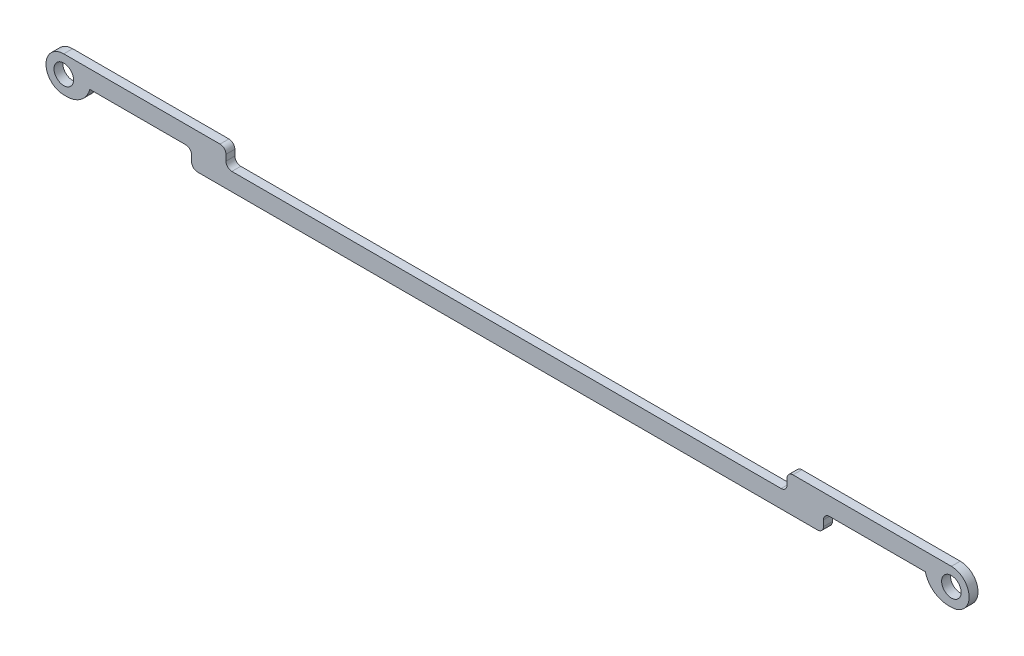
ISO-10303-21;
HEADER;
FILE_DESCRIPTION(('STEP AP214'),'2;1');
FILE_NAME('part.step','',(''),(''),'','','');
FILE_SCHEMA(('AUTOMOTIVE_DESIGN { 1 0 10303 214 1 1 1 1 }'));
ENDSEC;
DATA;
#1=APPLICATION_CONTEXT('core data for automotive mechanical design processes');
#2=APPLICATION_PROTOCOL_DEFINITION('international standard','automotive_design',2000,#1);
#3=PRODUCT_CONTEXT('',#1,'mechanical');
#4=PRODUCT('Part','Part','',(#3));
#5=PRODUCT_RELATED_PRODUCT_CATEGORY('part','',(#4));
#6=PRODUCT_DEFINITION_FORMATION('','',#4);
#7=PRODUCT_DEFINITION_CONTEXT('part definition',#1,'design');
#8=PRODUCT_DEFINITION('design','',#6,#7);
#9=PRODUCT_DEFINITION_SHAPE('','',#8);
#10=(LENGTH_UNIT() NAMED_UNIT(*) SI_UNIT(.MILLI.,.METRE.));
#11=(NAMED_UNIT(*) PLANE_ANGLE_UNIT() SI_UNIT($,.RADIAN.));
#12=(NAMED_UNIT(*) SI_UNIT($,.STERADIAN.) SOLID_ANGLE_UNIT());
#13=UNCERTAINTY_MEASURE_WITH_UNIT(LENGTH_MEASURE(1.E-05),#10,'distance_accuracy_value','');
#14=(GEOMETRIC_REPRESENTATION_CONTEXT(3) GLOBAL_UNCERTAINTY_ASSIGNED_CONTEXT((#13)) GLOBAL_UNIT_ASSIGNED_CONTEXT((#10,
#11,#12)) REPRESENTATION_CONTEXT('',''));
#15=CARTESIAN_POINT('',(0.,0.,0.));
#16=DIRECTION('',(0.,0.,1.));
#17=DIRECTION('',(1.,0.,0.));
#18=AXIS2_PLACEMENT_3D('',#15,#16,#17);
#19=CARTESIAN_POINT('',(0.,3.,1.5));
#20=DIRECTION('',(0.,-1.,0.));
#21=DIRECTION('',(0.,0.,-1.));
#22=AXIS2_PLACEMENT_3D('',#19,#20,#21);
#23=PLANE('',#22);
#24=DIRECTION('',(-1.,0.,0.));
#25=VECTOR('',#24,1.);
#26=CARTESIAN_POINT('',(0.,3.,1.5));
#27=LINE('',#26,#25);
#28=CARTESIAN_POINT('',(26.4131781331171,3.,1.5));
#29=VERTEX_POINT('',#28);
#30=CARTESIAN_POINT('',(0.,3.,1.5));
#31=VERTEX_POINT('',#30);
#32=EDGE_CURVE('E268',#29,#31,#27,.T.);
#33=ORIENTED_EDGE('',*,*,#32,.F.);
#34=DIRECTION('',(0.,0.,-1.));
#35=VECTOR('',#34,1.);
#36=CARTESIAN_POINT('',(26.4131781331171,3.,1.5));
#37=LINE('',#36,#35);
#38=CARTESIAN_POINT('',(26.4131781331171,3.,0.));
#39=VERTEX_POINT('',#38);
#40=EDGE_CURVE('E365',#29,#39,#37,.T.);
#41=ORIENTED_EDGE('',*,*,#40,.T.);
#42=DIRECTION('',(-1.,0.,0.));
#43=VECTOR('',#42,1.);
#44=CARTESIAN_POINT('',(0.,3.,0.));
#45=LINE('',#44,#43);
#46=CARTESIAN_POINT('',(0.,3.,0.));
#47=VERTEX_POINT('',#46);
#48=EDGE_CURVE('E281',#39,#47,#45,.T.);
#49=ORIENTED_EDGE('',*,*,#48,.T.);
#50=DIRECTION('',(0.,0.,-1.));
#51=VECTOR('',#50,1.);
#52=CARTESIAN_POINT('',(0.,3.,1.5));
#53=LINE('',#52,#51);
#54=EDGE_CURVE('E271',#31,#47,#53,.T.);
#55=ORIENTED_EDGE('',*,*,#54,.F.);
#56=EDGE_LOOP('',(#33,#41,#49,#55));
#57=FACE_BOUND('',#56,.T.);
#58=ADVANCED_FACE('F40',(#57),#23,.F.);
#59=CARTESIAN_POINT('',(0.,-3.,1.5));
#60=DIRECTION('',(0.,1.,0.));
#61=DIRECTION('',(0.,0.,1.));
#62=AXIS2_PLACEMENT_3D('',#59,#60,#61);
#63=PLANE('',#62);
#64=DIRECTION('',(1.,0.,0.));
#65=VECTOR('',#64,1.);
#66=CARTESIAN_POINT('',(0.,-3.,0.));
#67=LINE('',#66,#65);
#68=CARTESIAN_POINT('',(0.,-3.,0.));
#69=VERTEX_POINT('',#68);
#70=CARTESIAN_POINT('',(0.524849164062553,-3.,0.));
#71=VERTEX_POINT('',#70);
#72=EDGE_CURVE('E275',#69,#71,#67,.T.);
#73=ORIENTED_EDGE('',*,*,#72,.T.);
#74=DIRECTION('',(0.,0.,-1.));
#75=VECTOR('',#74,1.);
#76=CARTESIAN_POINT('',(0.524849164062553,-3.,1.5));
#77=LINE('',#76,#75);
#78=CARTESIAN_POINT('',(0.524849164062553,-3.,1.5));
#79=VERTEX_POINT('',#78);
#80=EDGE_CURVE('E306',#71,#79,#77,.F.);
#81=ORIENTED_EDGE('',*,*,#80,.T.);
#82=DIRECTION('',(1.,0.,0.));
#83=VECTOR('',#82,1.);
#84=CARTESIAN_POINT('',(0.,-3.,1.5));
#85=LINE('',#84,#83);
#86=CARTESIAN_POINT('',(0.,-3.,1.5));
#87=VERTEX_POINT('',#86);
#88=EDGE_CURVE('E220',#87,#79,#85,.T.);
#89=ORIENTED_EDGE('',*,*,#88,.F.);
#90=DIRECTION('',(0.,0.,-1.));
#91=VECTOR('',#90,1.);
#92=CARTESIAN_POINT('',(0.,-3.,1.5));
#93=LINE('',#92,#91);
#94=EDGE_CURVE('E292',#87,#69,#93,.T.);
#95=ORIENTED_EDGE('',*,*,#94,.T.);
#96=EDGE_LOOP('',(#73,#81,#89,#95));
#97=FACE_BOUND('',#96,.T.);
#98=ADVANCED_FACE('F480',(#97),#63,.F.);
#99=CARTESIAN_POINT('',(22.6079407956582,-3.,1.5));
#100=VERTEX_POINT('',#99);
#101=CARTESIAN_POINT('',(127.392059204342,-3.,1.5));
#102=VERTEX_POINT('',#101);
#103=EDGE_CURVE('E266',#100,#102,#85,.T.);
#104=ORIENTED_EDGE('',*,*,#103,.F.);
#105=DIRECTION('',(0.,0.,-1.));
#106=VECTOR('',#105,1.);
#107=CARTESIAN_POINT('',(22.6079407956582,-3.,1.5));
#108=LINE('',#107,#106);
#109=CARTESIAN_POINT('',(22.6079407956582,-3.,0.));
#110=VERTEX_POINT('',#109);
#111=EDGE_CURVE('E311',#100,#110,#108,.T.);
#112=ORIENTED_EDGE('',*,*,#111,.T.);
#113=CARTESIAN_POINT('',(127.392059204342,-3.,0.));
#114=VERTEX_POINT('',#113);
#115=EDGE_CURVE('E279',#110,#114,#67,.T.);
#116=ORIENTED_EDGE('',*,*,#115,.T.);
#117=DIRECTION('',(0.,0.,1.));
#118=VECTOR('',#117,1.);
#119=CARTESIAN_POINT('',(127.392059204342,-3.,1.5));
#120=LINE('',#119,#118);
#121=EDGE_CURVE('E308',#114,#102,#120,.T.);
#122=ORIENTED_EDGE('',*,*,#121,.T.);
#123=EDGE_LOOP('',(#104,#112,#116,#122));
#124=FACE_BOUND('',#123,.T.);
#125=ADVANCED_FACE('F428',(#124),#63,.F.);
#126=CARTESIAN_POINT('',(0.,0.,1.5));
#127=DIRECTION('',(0.,0.,1.));
#128=DIRECTION('',(1.,0.,0.));
#129=AXIS2_PLACEMENT_3D('',#126,#127,#128);
#130=PLANE('',#129);
#131=CARTESIAN_POINT('',(150.,3.,1.5));
#132=VERTEX_POINT('',#131);
#133=CARTESIAN_POINT('',(123.23055523657,3.,1.5));
#134=VERTEX_POINT('',#133);
#135=EDGE_CURVE('E269',#132,#134,#27,.T.);
#136=ORIENTED_EDGE('',*,*,#135,.T.);
#137=CARTESIAN_POINT('',(123.23055523657,2.,1.5));
#138=DIRECTION('',(0.,0.,1.));
#139=DIRECTION('',(1.,0.,0.));
#140=AXIS2_PLACEMENT_3D('',#137,#138,#139);
#141=CIRCLE('',#140,1.);
#142=CARTESIAN_POINT('',(122.23055523657,2.,1.5));
#143=VERTEX_POINT('',#142);
#144=EDGE_CURVE('E360',#134,#143,#141,.T.);
#145=ORIENTED_EDGE('',*,*,#144,.T.);
#146=DIRECTION('',(0.,1.,0.));
#147=VECTOR('',#146,1.);
#148=CARTESIAN_POINT('',(122.23055523657,9.54874152774472,1.5));
#149=LINE('',#148,#147);
#150=CARTESIAN_POINT('',(122.23055523657,0.999999999999999,1.5));
#151=VERTEX_POINT('',#150);
#152=EDGE_CURVE('E405',#151,#143,#149,.T.);
#153=ORIENTED_EDGE('',*,*,#152,.F.);
#154=CARTESIAN_POINT('',(121.23055523657,0.999999999999999,1.5));
#155=DIRECTION('',(0.,0.,1.));
#156=DIRECTION('',(1.,0.,0.));
#157=AXIS2_PLACEMENT_3D('',#154,#155,#156);
#158=CIRCLE('',#157,1.);
#159=CARTESIAN_POINT('',(121.23055523657,0.,1.5));
#160=VERTEX_POINT('',#159);
#161=EDGE_CURVE('E371',#151,#160,#158,.F.);
#162=ORIENTED_EDGE('',*,*,#161,.T.);
#163=DIRECTION('',(1.,0.,0.));
#164=VECTOR('',#163,1.);
#165=CARTESIAN_POINT('',(27.4131781331171,0.,1.5));
#166=LINE('',#165,#164);
#167=CARTESIAN_POINT('',(28.4131781331171,0.,1.5));
#168=VERTEX_POINT('',#167);
#169=EDGE_CURVE('E379',#168,#160,#166,.T.);
#170=ORIENTED_EDGE('',*,*,#169,.F.);
#171=CARTESIAN_POINT('',(28.4131781331171,1.,1.5));
#172=DIRECTION('',(0.,0.,1.));
#173=DIRECTION('',(1.,0.,0.));
#174=AXIS2_PLACEMENT_3D('',#171,#172,#173);
#175=CIRCLE('',#174,1.);
#176=CARTESIAN_POINT('',(27.4131781331171,0.999999999999999,1.5));
#177=VERTEX_POINT('',#176);
#178=EDGE_CURVE('E48',#168,#177,#175,.F.);
#179=ORIENTED_EDGE('',*,*,#178,.T.);
#180=DIRECTION('',(0.,-1.,0.));
#181=VECTOR('',#180,1.);
#182=CARTESIAN_POINT('',(27.4131781331171,9.54874152774472,1.5));
#183=LINE('',#182,#181);
#184=CARTESIAN_POINT('',(27.4131781331171,2.,1.5));
#185=VERTEX_POINT('',#184);
#186=EDGE_CURVE('E376',#185,#177,#183,.T.);
#187=ORIENTED_EDGE('',*,*,#186,.F.);
#188=CARTESIAN_POINT('',(26.4131781331171,2.,1.5));
#189=DIRECTION('',(0.,0.,1.));
#190=DIRECTION('',(1.,0.,0.));
#191=AXIS2_PLACEMENT_3D('',#188,#189,#190);
#192=CIRCLE('',#191,1.);
#193=EDGE_CURVE('E358',#185,#29,#192,.T.);
#194=ORIENTED_EDGE('',*,*,#193,.T.);
#195=ORIENTED_EDGE('',*,*,#32,.T.);
#196=CARTESIAN_POINT('',(0.,0.,1.5));
#197=DIRECTION('',(0.,0.,1.));
#198=DIRECTION('',(1.,0.,0.));
#199=AXIS2_PLACEMENT_3D('',#196,#197,#198);
#200=CIRCLE('',#199,3.);
#201=EDGE_CURVE('E260',#31,#87,#200,.T.);
#202=ORIENTED_EDGE('',*,*,#201,.T.);
#203=ORIENTED_EDGE('',*,*,#88,.T.);
#204=CARTESIAN_POINT('',(0.524849164062553,1.,1.5));
#205=DIRECTION('',(0.,0.,1.));
#206=DIRECTION('',(1.,0.,0.));
#207=AXIS2_PLACEMENT_3D('',#204,#205,#206);
#208=CIRCLE('',#207,4.);
#209=CARTESIAN_POINT('',(4.39783251026997,0.,1.5));
#210=VERTEX_POINT('',#209);
#211=EDGE_CURVE('E215',#79,#210,#208,.T.);
#212=ORIENTED_EDGE('',*,*,#211,.T.);
#213=DIRECTION('',(-1.,0.,0.));
#214=VECTOR('',#213,1.);
#215=CARTESIAN_POINT('',(4.39783251026997,0.,1.5));
#216=LINE('',#215,#214);
#217=CARTESIAN_POINT('',(20.6079407956581,0.,1.5));
#218=VERTEX_POINT('',#217);
#219=EDGE_CURVE('E202',#218,#210,#216,.T.);
#220=ORIENTED_EDGE('',*,*,#219,.F.);
#221=CARTESIAN_POINT('',(20.6079407956581,-1.,1.5));
#222=DIRECTION('',(0.,0.,1.));
#223=DIRECTION('',(1.,0.,0.));
#224=AXIS2_PLACEMENT_3D('',#221,#222,#223);
#225=CIRCLE('',#224,1.);
#226=CARTESIAN_POINT('',(21.6079407956581,-1.,1.5));
#227=VERTEX_POINT('',#226);
#228=EDGE_CURVE('E334',#218,#227,#225,.F.);
#229=ORIENTED_EDGE('',*,*,#228,.T.);
#230=DIRECTION('',(0.,1.,0.));
#231=VECTOR('',#230,1.);
#232=CARTESIAN_POINT('',(21.6079407956581,-5.43793538641678,1.5));
#233=LINE('',#232,#231);
#234=CARTESIAN_POINT('',(21.6079407956581,-2.,1.5));
#235=VERTEX_POINT('',#234);
#236=EDGE_CURVE('E212',#235,#227,#233,.T.);
#237=ORIENTED_EDGE('',*,*,#236,.F.);
#238=CARTESIAN_POINT('',(22.6079407956582,-2.,1.5));
#239=DIRECTION('',(0.,0.,1.));
#240=DIRECTION('',(1.,0.,0.));
#241=AXIS2_PLACEMENT_3D('',#238,#239,#240);
#242=CIRCLE('',#241,1.);
#243=EDGE_CURVE('E324',#235,#100,#242,.T.);
#244=ORIENTED_EDGE('',*,*,#243,.T.);
#245=ORIENTED_EDGE('',*,*,#103,.T.);
#246=CARTESIAN_POINT('',(127.392059204342,-2.,1.5));
#247=DIRECTION('',(0.,0.,1.));
#248=DIRECTION('',(1.,0.,0.));
#249=AXIS2_PLACEMENT_3D('',#246,#247,#248);
#250=CIRCLE('',#249,1.);
#251=CARTESIAN_POINT('',(128.392059204342,-2.,1.5));
#252=VERTEX_POINT('',#251);
#253=EDGE_CURVE('E322',#102,#252,#250,.T.);
#254=ORIENTED_EDGE('',*,*,#253,.T.);
#255=DIRECTION('',(0.,-1.,0.));
#256=VECTOR('',#255,1.);
#257=CARTESIAN_POINT('',(128.392059204342,-5.43793538641678,1.5));
#258=LINE('',#257,#256);
#259=CARTESIAN_POINT('',(128.392059204342,-1.,1.5));
#260=VERTEX_POINT('',#259);
#261=EDGE_CURVE('E239',#260,#252,#258,.T.);
#262=ORIENTED_EDGE('',*,*,#261,.F.);
#263=CARTESIAN_POINT('',(129.392059204342,-1.,1.5));
#264=DIRECTION('',(0.,0.,1.));
#265=DIRECTION('',(1.,0.,0.));
#266=AXIS2_PLACEMENT_3D('',#263,#264,#265);
#267=CIRCLE('',#266,1.);
#268=CARTESIAN_POINT('',(129.392059204342,0.,1.5));
#269=VERTEX_POINT('',#268);
#270=EDGE_CURVE('E338',#260,#269,#267,.F.);
#271=ORIENTED_EDGE('',*,*,#270,.T.);
#272=DIRECTION('',(-1.,0.,0.));
#273=VECTOR('',#272,1.);
#274=CARTESIAN_POINT('',(145.60216748973,0.,1.5));
#275=LINE('',#274,#273);
#276=CARTESIAN_POINT('',(145.60216748973,0.,1.5));
#277=VERTEX_POINT('',#276);
#278=EDGE_CURVE('E236',#277,#269,#275,.T.);
#279=ORIENTED_EDGE('',*,*,#278,.F.);
#280=CARTESIAN_POINT('',(149.475150835937,1.,1.5));
#281=DIRECTION('',(0.,0.,1.));
#282=DIRECTION('',(1.,0.,0.));
#283=AXIS2_PLACEMENT_3D('',#280,#281,#282);
#284=CIRCLE('',#283,4.);
#285=CARTESIAN_POINT('',(149.475150835937,-3.,1.5));
#286=VERTEX_POINT('',#285);
#287=EDGE_CURVE('E224',#277,#286,#284,.T.);
#288=ORIENTED_EDGE('',*,*,#287,.T.);
#289=CARTESIAN_POINT('',(150.,-3.,1.5));
#290=VERTEX_POINT('',#289);
#291=EDGE_CURVE('E262',#286,#290,#85,.T.);
#292=ORIENTED_EDGE('',*,*,#291,.T.);
#293=CARTESIAN_POINT('',(150.,0.,1.5));
#294=DIRECTION('',(0.,0.,1.));
#295=DIRECTION('',(1.,0.,0.));
#296=AXIS2_PLACEMENT_3D('',#293,#294,#295);
#297=CIRCLE('',#296,3.);
#298=EDGE_CURVE('E265',#290,#132,#297,.T.);
#299=ORIENTED_EDGE('',*,*,#298,.T.);
#300=EDGE_LOOP('',(#136,#145,#153,#162,#170,#179,#187,#194,#195,#202,#203,#212,#220,#229,#237,
#244,#245,#254,#262,#271,#279,#288,#292,#299));
#301=FACE_BOUND('',#300,.T.);
#302=CARTESIAN_POINT('',(0.,0.,1.5));
#303=DIRECTION('',(0.,0.,1.));
#304=DIRECTION('',(1.,0.,0.));
#305=AXIS2_PLACEMENT_3D('',#302,#303,#304);
#306=CIRCLE('',#305,1.65);
#307=CARTESIAN_POINT('',(1.65,0.,1.5));
#308=VERTEX_POINT('',#307);
#309=EDGE_CURVE('E254',#308,#308,#306,.T.);
#310=ORIENTED_EDGE('',*,*,#309,.F.);
#311=EDGE_LOOP('',(#310));
#312=FACE_BOUND('',#311,.T.);
#313=CARTESIAN_POINT('',(150.,0.,1.5));
#314=DIRECTION('',(0.,0.,1.));
#315=DIRECTION('',(1.,0.,0.));
#316=AXIS2_PLACEMENT_3D('',#313,#314,#315);
#317=CIRCLE('',#316,1.65000000000002);
#318=CARTESIAN_POINT('',(151.65,0.,1.5));
#319=VERTEX_POINT('',#318);
#320=EDGE_CURVE('E248',#319,#319,#317,.T.);
#321=ORIENTED_EDGE('',*,*,#320,.F.);
#322=EDGE_LOOP('',(#321));
#323=FACE_BOUND('',#322,.T.);
#324=ADVANCED_FACE('F217',(#301,#312,#323),#130,.T.);
#325=CARTESIAN_POINT('',(0.,0.,0.));
#326=DIRECTION('',(0.,0.,1.));
#327=DIRECTION('',(1.,0.,0.));
#328=AXIS2_PLACEMENT_3D('',#325,#326,#327);
#329=PLANE('',#328);
#330=DIRECTION('',(0.,1.,0.));
#331=VECTOR('',#330,1.);
#332=CARTESIAN_POINT('',(122.23055523657,0.,0.));
#333=LINE('',#332,#331);
#334=CARTESIAN_POINT('',(122.23055523657,0.999999999999999,0.));
#335=VERTEX_POINT('',#334);
#336=CARTESIAN_POINT('',(122.23055523657,2.,0.));
#337=VERTEX_POINT('',#336);
#338=EDGE_CURVE('E398',#335,#337,#333,.T.);
#339=ORIENTED_EDGE('',*,*,#338,.T.);
#340=CARTESIAN_POINT('',(123.23055523657,2.,0.));
#341=DIRECTION('',(0.,0.,1.));
#342=DIRECTION('',(1.,0.,0.));
#343=AXIS2_PLACEMENT_3D('',#340,#341,#342);
#344=CIRCLE('',#343,1.);
#345=CARTESIAN_POINT('',(123.23055523657,3.,0.));
#346=VERTEX_POINT('',#345);
#347=EDGE_CURVE('E363',#337,#346,#344,.F.);
#348=ORIENTED_EDGE('',*,*,#347,.T.);
#349=CARTESIAN_POINT('',(150.,3.,0.));
#350=VERTEX_POINT('',#349);
#351=EDGE_CURVE('E263',#350,#346,#45,.T.);
#352=ORIENTED_EDGE('',*,*,#351,.F.);
#353=CARTESIAN_POINT('',(150.,0.,0.));
#354=DIRECTION('',(0.,0.,1.));
#355=DIRECTION('',(1.,0.,0.));
#356=AXIS2_PLACEMENT_3D('',#353,#354,#355);
#357=CIRCLE('',#356,3.);
#358=CARTESIAN_POINT('',(150.,-3.,0.));
#359=VERTEX_POINT('',#358);
#360=EDGE_CURVE('E278',#359,#350,#357,.T.);
#361=ORIENTED_EDGE('',*,*,#360,.F.);
#362=CARTESIAN_POINT('',(149.475150835937,-3.,0.));
#363=VERTEX_POINT('',#362);
#364=EDGE_CURVE('E274',#363,#359,#67,.T.);
#365=ORIENTED_EDGE('',*,*,#364,.F.);
#366=CARTESIAN_POINT('',(149.475150835937,1.,0.));
#367=DIRECTION('',(0.,0.,1.));
#368=DIRECTION('',(1.,0.,0.));
#369=AXIS2_PLACEMENT_3D('',#366,#367,#368);
#370=CIRCLE('',#369,4.);
#371=CARTESIAN_POINT('',(145.60216748973,0.,0.));
#372=VERTEX_POINT('',#371);
#373=EDGE_CURVE('E225',#363,#372,#370,.F.);
#374=ORIENTED_EDGE('',*,*,#373,.T.);
#375=DIRECTION('',(-1.,0.,0.));
#376=VECTOR('',#375,1.);
#377=CARTESIAN_POINT('',(0.,0.,0.));
#378=LINE('',#377,#376);
#379=CARTESIAN_POINT('',(129.392059204342,0.,0.));
#380=VERTEX_POINT('',#379);
#381=EDGE_CURVE('E295',#372,#380,#378,.T.);
#382=ORIENTED_EDGE('',*,*,#381,.T.);
#383=CARTESIAN_POINT('',(129.392059204342,-1.,0.));
#384=DIRECTION('',(0.,0.,1.));
#385=DIRECTION('',(1.,0.,0.));
#386=AXIS2_PLACEMENT_3D('',#383,#384,#385);
#387=CIRCLE('',#386,1.);
#388=CARTESIAN_POINT('',(128.392059204342,-1.,0.));
#389=VERTEX_POINT('',#388);
#390=EDGE_CURVE('E340',#380,#389,#387,.T.);
#391=ORIENTED_EDGE('',*,*,#390,.T.);
#392=DIRECTION('',(0.,-1.,0.));
#393=VECTOR('',#392,1.);
#394=CARTESIAN_POINT('',(128.392059204342,0.,0.));
#395=LINE('',#394,#393);
#396=CARTESIAN_POINT('',(128.392059204342,-2.,0.));
#397=VERTEX_POINT('',#396);
#398=EDGE_CURVE('E229',#389,#397,#395,.T.);
#399=ORIENTED_EDGE('',*,*,#398,.T.);
#400=CARTESIAN_POINT('',(127.392059204342,-2.,0.));
#401=DIRECTION('',(0.,0.,1.));
#402=DIRECTION('',(1.,0.,0.));
#403=AXIS2_PLACEMENT_3D('',#400,#401,#402);
#404=CIRCLE('',#403,1.);
#405=EDGE_CURVE('E314',#397,#114,#404,.F.);
#406=ORIENTED_EDGE('',*,*,#405,.T.);
#407=ORIENTED_EDGE('',*,*,#115,.F.);
#408=CARTESIAN_POINT('',(22.6079407956582,-2.,0.));
#409=DIRECTION('',(0.,0.,1.));
#410=DIRECTION('',(1.,0.,0.));
#411=AXIS2_PLACEMENT_3D('',#408,#409,#410);
#412=CIRCLE('',#411,1.);
#413=CARTESIAN_POINT('',(21.6079407956581,-2.,0.));
#414=VERTEX_POINT('',#413);
#415=EDGE_CURVE('E316',#110,#414,#412,.F.);
#416=ORIENTED_EDGE('',*,*,#415,.T.);
#417=DIRECTION('',(0.,1.,0.));
#418=VECTOR('',#417,1.);
#419=CARTESIAN_POINT('',(21.6079407956581,0.,0.));
#420=LINE('',#419,#418);
#421=CARTESIAN_POINT('',(21.6079407956581,-1.,0.));
#422=VERTEX_POINT('',#421);
#423=EDGE_CURVE('E232',#414,#422,#420,.T.);
#424=ORIENTED_EDGE('',*,*,#423,.T.);
#425=CARTESIAN_POINT('',(20.6079407956581,-1.,0.));
#426=DIRECTION('',(0.,0.,1.));
#427=DIRECTION('',(1.,0.,0.));
#428=AXIS2_PLACEMENT_3D('',#425,#426,#427);
#429=CIRCLE('',#428,1.);
#430=CARTESIAN_POINT('',(20.6079407956581,0.,0.));
#431=VERTEX_POINT('',#430);
#432=EDGE_CURVE('E336',#422,#431,#429,.T.);
#433=ORIENTED_EDGE('',*,*,#432,.T.);
#434=DIRECTION('',(-1.,0.,0.));
#435=VECTOR('',#434,1.);
#436=CARTESIAN_POINT('',(0.,0.,0.));
#437=LINE('',#436,#435);
#438=CARTESIAN_POINT('',(4.39783251026997,0.,0.));
#439=VERTEX_POINT('',#438);
#440=EDGE_CURVE('E298',#431,#439,#437,.T.);
#441=ORIENTED_EDGE('',*,*,#440,.T.);
#442=CARTESIAN_POINT('',(0.524849164062553,1.,0.));
#443=DIRECTION('',(0.,0.,1.));
#444=DIRECTION('',(1.,0.,0.));
#445=AXIS2_PLACEMENT_3D('',#442,#443,#444);
#446=CIRCLE('',#445,4.);
#447=EDGE_CURVE('E228',#439,#71,#446,.F.);
#448=ORIENTED_EDGE('',*,*,#447,.T.);
#449=ORIENTED_EDGE('',*,*,#72,.F.);
#450=CARTESIAN_POINT('',(0.,0.,0.));
#451=DIRECTION('',(0.,0.,1.));
#452=DIRECTION('',(1.,0.,0.));
#453=AXIS2_PLACEMENT_3D('',#450,#451,#452);
#454=CIRCLE('',#453,3.);
#455=EDGE_CURVE('E257',#47,#69,#454,.T.);
#456=ORIENTED_EDGE('',*,*,#455,.F.);
#457=ORIENTED_EDGE('',*,*,#48,.F.);
#458=CARTESIAN_POINT('',(26.4131781331171,2.,0.));
#459=DIRECTION('',(0.,0.,1.));
#460=DIRECTION('',(1.,0.,0.));
#461=AXIS2_PLACEMENT_3D('',#458,#459,#460);
#462=CIRCLE('',#461,1.);
#463=CARTESIAN_POINT('',(27.4131781331171,2.,0.));
#464=VERTEX_POINT('',#463);
#465=EDGE_CURVE('E62',#39,#464,#462,.F.);
#466=ORIENTED_EDGE('',*,*,#465,.T.);
#467=DIRECTION('',(0.,-1.,0.));
#468=VECTOR('',#467,1.);
#469=CARTESIAN_POINT('',(27.4131781331171,0.,0.));
#470=LINE('',#469,#468);
#471=CARTESIAN_POINT('',(27.4131781331171,1.,0.));
#472=VERTEX_POINT('',#471);
#473=EDGE_CURVE('E240',#464,#472,#470,.T.);
#474=ORIENTED_EDGE('',*,*,#473,.T.);
#475=CARTESIAN_POINT('',(28.4131781331171,1.,0.));
#476=DIRECTION('',(0.,0.,1.));
#477=DIRECTION('',(1.,0.,0.));
#478=AXIS2_PLACEMENT_3D('',#475,#476,#477);
#479=CIRCLE('',#478,1.);
#480=CARTESIAN_POINT('',(28.4131781331171,0.,0.));
#481=VERTEX_POINT('',#480);
#482=EDGE_CURVE('E11',#472,#481,#479,.T.);
#483=ORIENTED_EDGE('',*,*,#482,.T.);
#484=DIRECTION('',(1.,0.,0.));
#485=VECTOR('',#484,1.);
#486=CARTESIAN_POINT('',(0.,0.,0.));
#487=LINE('',#486,#485);
#488=CARTESIAN_POINT('',(121.23055523657,0.,0.));
#489=VERTEX_POINT('',#488);
#490=EDGE_CURVE('E342',#481,#489,#487,.T.);
#491=ORIENTED_EDGE('',*,*,#490,.T.);
#492=CARTESIAN_POINT('',(121.23055523657,0.999999999999999,0.));
#493=DIRECTION('',(0.,0.,1.));
#494=DIRECTION('',(1.,0.,0.));
#495=AXIS2_PLACEMENT_3D('',#492,#493,#494);
#496=CIRCLE('',#495,1.);
#497=EDGE_CURVE('E373',#489,#335,#496,.T.);
#498=ORIENTED_EDGE('',*,*,#497,.T.);
#499=EDGE_LOOP('',(#339,#348,#352,#361,#365,#374,#382,#391,#399,#406,#407,#416,#424,#433,#441,
#448,#449,#456,#457,#466,#474,#483,#491,#498));
#500=FACE_BOUND('',#499,.T.);
#501=CARTESIAN_POINT('',(0.,0.,0.));
#502=DIRECTION('',(0.,0.,1.));
#503=DIRECTION('',(1.,0.,0.));
#504=AXIS2_PLACEMENT_3D('',#501,#502,#503);
#505=CIRCLE('',#504,1.65);
#506=CARTESIAN_POINT('',(1.65,0.,0.));
#507=VERTEX_POINT('',#506);
#508=EDGE_CURVE('E251',#507,#507,#505,.T.);
#509=ORIENTED_EDGE('',*,*,#508,.T.);
#510=EDGE_LOOP('',(#509));
#511=FACE_BOUND('',#510,.T.);
#512=CARTESIAN_POINT('',(150.,0.,0.));
#513=DIRECTION('',(0.,0.,1.));
#514=DIRECTION('',(1.,0.,0.));
#515=AXIS2_PLACEMENT_3D('',#512,#513,#514);
#516=CIRCLE('',#515,1.65000000000002);
#517=CARTESIAN_POINT('',(151.65,0.,0.));
#518=VERTEX_POINT('',#517);
#519=EDGE_CURVE('E247',#518,#518,#516,.T.);
#520=ORIENTED_EDGE('',*,*,#519,.T.);
#521=EDGE_LOOP('',(#520));
#522=FACE_BOUND('',#521,.T.);
#523=ADVANCED_FACE('F388',(#500,#511,#522),#329,.F.);
#524=CARTESIAN_POINT('',(0.,0.,1.5));
#525=DIRECTION('',(0.,0.,-1.));
#526=DIRECTION('',(-1.,0.,0.));
#527=AXIS2_PLACEMENT_3D('',#524,#525,#526);
#528=CYLINDRICAL_SURFACE('',#527,3.);
#529=ORIENTED_EDGE('',*,*,#455,.T.);
#530=ORIENTED_EDGE('',*,*,#94,.F.);
#531=ORIENTED_EDGE('',*,*,#201,.F.);
#532=ORIENTED_EDGE('',*,*,#54,.T.);
#533=EDGE_LOOP('',(#529,#530,#531,#532));
#534=FACE_BOUND('',#533,.T.);
#535=ADVANCED_FACE('F503',(#534),#528,.T.);
#536=ORIENTED_EDGE('',*,*,#291,.F.);
#537=DIRECTION('',(0.,0.,1.));
#538=VECTOR('',#537,1.);
#539=CARTESIAN_POINT('',(149.475150835937,-3.,1.5));
#540=LINE('',#539,#538);
#541=EDGE_CURVE('E300',#286,#363,#540,.F.);
#542=ORIENTED_EDGE('',*,*,#541,.T.);
#543=ORIENTED_EDGE('',*,*,#364,.T.);
#544=DIRECTION('',(0.,0.,-1.));
#545=VECTOR('',#544,1.);
#546=CARTESIAN_POINT('',(150.,-3.,1.5));
#547=LINE('',#546,#545);
#548=EDGE_CURVE('E289',#290,#359,#547,.T.);
#549=ORIENTED_EDGE('',*,*,#548,.F.);
#550=EDGE_LOOP('',(#536,#542,#543,#549));
#551=FACE_BOUND('',#550,.T.);
#552=ADVANCED_FACE('F439',(#551),#63,.F.);
#553=CARTESIAN_POINT('',(150.,0.,1.5));
#554=DIRECTION('',(0.,0.,-1.));
#555=DIRECTION('',(-1.,0.,0.));
#556=AXIS2_PLACEMENT_3D('',#553,#554,#555);
#557=CYLINDRICAL_SURFACE('',#556,3.);
#558=ORIENTED_EDGE('',*,*,#360,.T.);
#559=DIRECTION('',(0.,0.,-1.));
#560=VECTOR('',#559,1.);
#561=CARTESIAN_POINT('',(150.,3.,1.5));
#562=LINE('',#561,#560);
#563=EDGE_CURVE('E286',#132,#350,#562,.T.);
#564=ORIENTED_EDGE('',*,*,#563,.F.);
#565=ORIENTED_EDGE('',*,*,#298,.F.);
#566=ORIENTED_EDGE('',*,*,#548,.T.);
#567=EDGE_LOOP('',(#558,#564,#565,#566));
#568=FACE_BOUND('',#567,.T.);
#569=ADVANCED_FACE('F443',(#568),#557,.T.);
#570=ORIENTED_EDGE('',*,*,#351,.T.);
#571=DIRECTION('',(0.,0.,1.));
#572=VECTOR('',#571,1.);
#573=CARTESIAN_POINT('',(123.23055523657,3.,1.5));
#574=LINE('',#573,#572);
#575=EDGE_CURVE('E355',#346,#134,#574,.T.);
#576=ORIENTED_EDGE('',*,*,#575,.T.);
#577=ORIENTED_EDGE('',*,*,#135,.F.);
#578=ORIENTED_EDGE('',*,*,#563,.T.);
#579=EDGE_LOOP('',(#570,#576,#577,#578));
#580=FACE_BOUND('',#579,.T.);
#581=ADVANCED_FACE('F447',(#580),#23,.F.);
#582=CARTESIAN_POINT('',(0.,0.,1.5));
#583=DIRECTION('',(0.,0.,-1.));
#584=DIRECTION('',(-1.,0.,0.));
#585=AXIS2_PLACEMENT_3D('',#582,#583,#584);
#586=CYLINDRICAL_SURFACE('',#585,1.65);
#587=ORIENTED_EDGE('',*,*,#309,.T.);
#588=EDGE_LOOP('',(#587));
#589=FACE_BOUND('',#588,.T.);
#590=ORIENTED_EDGE('',*,*,#508,.F.);
#591=EDGE_LOOP('',(#590));
#592=FACE_BOUND('',#591,.T.);
#593=ADVANCED_FACE('F492',(#589,#592),#586,.F.);
#594=CARTESIAN_POINT('',(150.,0.,1.5));
#595=DIRECTION('',(0.,0.,-1.));
#596=DIRECTION('',(-1.,0.,0.));
#597=AXIS2_PLACEMENT_3D('',#594,#595,#596);
#598=CYLINDRICAL_SURFACE('',#597,1.65000000000002);
#599=ORIENTED_EDGE('',*,*,#320,.T.);
#600=EDGE_LOOP('',(#599));
#601=FACE_BOUND('',#600,.T.);
#602=ORIENTED_EDGE('',*,*,#519,.F.);
#603=EDGE_LOOP('',(#602));
#604=FACE_BOUND('',#603,.T.);
#605=ADVANCED_FACE('F497',(#601,#604),#598,.F.);
#606=CARTESIAN_POINT('',(145.60216748973,0.,-18.5));
#607=DIRECTION('',(0.,1.,0.));
#608=DIRECTION('',(0.,0.,1.));
#609=AXIS2_PLACEMENT_3D('',#606,#607,#608);
#610=PLANE('',#609);
#611=ORIENTED_EDGE('',*,*,#278,.T.);
#612=DIRECTION('',(0.,0.,1.));
#613=VECTOR('',#612,1.);
#614=CARTESIAN_POINT('',(129.392059204342,0.,0.));
#615=LINE('',#614,#613);
#616=EDGE_CURVE('E332',#269,#380,#615,.F.);
#617=ORIENTED_EDGE('',*,*,#616,.T.);
#618=ORIENTED_EDGE('',*,*,#381,.F.);
#619=DIRECTION('',(0.,0.,1.));
#620=VECTOR('',#619,1.);
#621=CARTESIAN_POINT('',(145.60216748973,0.,-18.5));
#622=LINE('',#621,#620);
#623=EDGE_CURVE('E243',#372,#277,#622,.T.);
#624=ORIENTED_EDGE('',*,*,#623,.T.);
#625=EDGE_LOOP('',(#611,#617,#618,#624));
#626=FACE_BOUND('',#625,.T.);
#627=ADVANCED_FACE('F466',(#626),#610,.F.);
#628=CARTESIAN_POINT('',(128.392059204342,-5.43793538641678,-18.5));
#629=DIRECTION('',(-1.,0.,0.));
#630=DIRECTION('',(0.,0.,1.));
#631=AXIS2_PLACEMENT_3D('',#628,#629,#630);
#632=PLANE('',#631);
#633=ORIENTED_EDGE('',*,*,#398,.F.);
#634=DIRECTION('',(0.,0.,1.));
#635=VECTOR('',#634,1.);
#636=CARTESIAN_POINT('',(128.392059204342,-1.,1.5));
#637=LINE('',#636,#635);
#638=EDGE_CURVE('E329',#389,#260,#637,.T.);
#639=ORIENTED_EDGE('',*,*,#638,.T.);
#640=ORIENTED_EDGE('',*,*,#261,.T.);
#641=DIRECTION('',(0.,0.,1.));
#642=VECTOR('',#641,1.);
#643=CARTESIAN_POINT('',(128.392059204342,-2.,-18.5));
#644=LINE('',#643,#642);
#645=EDGE_CURVE('E327',#252,#397,#644,.F.);
#646=ORIENTED_EDGE('',*,*,#645,.T.);
#647=EDGE_LOOP('',(#633,#639,#640,#646));
#648=FACE_BOUND('',#647,.T.);
#649=ADVANCED_FACE('F459',(#648),#632,.F.);
#650=CARTESIAN_POINT('',(4.39783251026997,0.,-18.5));
#651=DIRECTION('',(0.,1.,0.));
#652=DIRECTION('',(0.,0.,1.));
#653=AXIS2_PLACEMENT_3D('',#650,#651,#652);
#654=PLANE('',#653);
#655=ORIENTED_EDGE('',*,*,#440,.F.);
#656=DIRECTION('',(0.,0.,1.));
#657=VECTOR('',#656,1.);
#658=CARTESIAN_POINT('',(20.6079407956581,0.,1.5));
#659=LINE('',#658,#657);
#660=EDGE_CURVE('E210',#431,#218,#659,.T.);
#661=ORIENTED_EDGE('',*,*,#660,.T.);
#662=ORIENTED_EDGE('',*,*,#219,.T.);
#663=DIRECTION('',(0.,0.,1.));
#664=VECTOR('',#663,1.);
#665=CARTESIAN_POINT('',(4.39783251026997,0.,-18.5));
#666=LINE('',#665,#664);
#667=EDGE_CURVE('E207',#439,#210,#666,.T.);
#668=ORIENTED_EDGE('',*,*,#667,.F.);
#669=EDGE_LOOP('',(#655,#661,#662,#668));
#670=FACE_BOUND('',#669,.T.);
#671=ADVANCED_FACE('F205',(#670),#654,.F.);
#672=CARTESIAN_POINT('',(21.6079407956581,-5.43793538641678,-18.5));
#673=DIRECTION('',(1.,0.,0.));
#674=DIRECTION('',(0.,0.,-1.));
#675=AXIS2_PLACEMENT_3D('',#672,#673,#674);
#676=PLANE('',#675);
#677=ORIENTED_EDGE('',*,*,#423,.F.);
#678=DIRECTION('',(0.,0.,-1.));
#679=VECTOR('',#678,1.);
#680=CARTESIAN_POINT('',(21.6079407956581,-2.,-18.5));
#681=LINE('',#680,#679);
#682=EDGE_CURVE('E320',#414,#235,#681,.F.);
#683=ORIENTED_EDGE('',*,*,#682,.T.);
#684=ORIENTED_EDGE('',*,*,#236,.T.);
#685=DIRECTION('',(0.,0.,1.));
#686=VECTOR('',#685,1.);
#687=CARTESIAN_POINT('',(21.6079407956581,-1.,0.));
#688=LINE('',#687,#686);
#689=EDGE_CURVE('E318',#227,#422,#688,.F.);
#690=ORIENTED_EDGE('',*,*,#689,.T.);
#691=EDGE_LOOP('',(#677,#683,#684,#690));
#692=FACE_BOUND('',#691,.T.);
#693=ADVANCED_FACE('F415',(#692),#676,.F.);
#694=CARTESIAN_POINT('',(149.475150835937,1.,-18.5));
#695=DIRECTION('',(0.,0.,1.));
#696=DIRECTION('',(1.,0.,0.));
#697=AXIS2_PLACEMENT_3D('',#694,#695,#696);
#698=CYLINDRICAL_SURFACE('',#697,4.);
#699=ORIENTED_EDGE('',*,*,#287,.F.);
#700=ORIENTED_EDGE('',*,*,#623,.F.);
#701=ORIENTED_EDGE('',*,*,#373,.F.);
#702=ORIENTED_EDGE('',*,*,#541,.F.);
#703=EDGE_LOOP('',(#699,#700,#701,#702));
#704=FACE_BOUND('',#703,.T.);
#705=ADVANCED_FACE('F469',(#704),#698,.T.);
#706=CARTESIAN_POINT('',(0.524849164062553,1.,-18.5));
#707=DIRECTION('',(0.,0.,-1.));
#708=DIRECTION('',(-1.,0.,0.));
#709=AXIS2_PLACEMENT_3D('',#706,#707,#708);
#710=CYLINDRICAL_SURFACE('',#709,4.);
#711=ORIENTED_EDGE('',*,*,#447,.F.);
#712=ORIENTED_EDGE('',*,*,#667,.T.);
#713=ORIENTED_EDGE('',*,*,#211,.F.);
#714=ORIENTED_EDGE('',*,*,#80,.F.);
#715=EDGE_LOOP('',(#711,#712,#713,#714));
#716=FACE_BOUND('',#715,.T.);
#717=ADVANCED_FACE('F227',(#716),#710,.T.);
#718=CARTESIAN_POINT('',(22.6079407956582,-2.,1.5));
#719=DIRECTION('',(0.,0.,-1.));
#720=DIRECTION('',(-1.,0.,0.));
#721=AXIS2_PLACEMENT_3D('',#718,#719,#720);
#722=CYLINDRICAL_SURFACE('',#721,1.);
#723=ORIENTED_EDGE('',*,*,#243,.F.);
#724=ORIENTED_EDGE('',*,*,#682,.F.);
#725=ORIENTED_EDGE('',*,*,#415,.F.);
#726=ORIENTED_EDGE('',*,*,#111,.F.);
#727=EDGE_LOOP('',(#723,#724,#725,#726));
#728=FACE_BOUND('',#727,.T.);
#729=ADVANCED_FACE('F423',(#728),#722,.T.);
#730=CARTESIAN_POINT('',(20.6079407956581,-1.,-18.5));
#731=DIRECTION('',(0.,0.,-1.));
#732=DIRECTION('',(-1.,0.,0.));
#733=AXIS2_PLACEMENT_3D('',#730,#731,#732);
#734=CYLINDRICAL_SURFACE('',#733,1.);
#735=ORIENTED_EDGE('',*,*,#432,.F.);
#736=ORIENTED_EDGE('',*,*,#689,.F.);
#737=ORIENTED_EDGE('',*,*,#228,.F.);
#738=ORIENTED_EDGE('',*,*,#660,.F.);
#739=EDGE_LOOP('',(#735,#736,#737,#738));
#740=FACE_BOUND('',#739,.T.);
#741=ADVANCED_FACE('F420',(#740),#734,.F.);
#742=CARTESIAN_POINT('',(129.392059204342,-1.,-18.5));
#743=DIRECTION('',(0.,0.,-1.));
#744=DIRECTION('',(-1.,0.,0.));
#745=AXIS2_PLACEMENT_3D('',#742,#743,#744);
#746=CYLINDRICAL_SURFACE('',#745,1.);
#747=ORIENTED_EDGE('',*,*,#390,.F.);
#748=ORIENTED_EDGE('',*,*,#616,.F.);
#749=ORIENTED_EDGE('',*,*,#270,.F.);
#750=ORIENTED_EDGE('',*,*,#638,.F.);
#751=EDGE_LOOP('',(#747,#748,#749,#750));
#752=FACE_BOUND('',#751,.T.);
#753=ADVANCED_FACE('F463',(#752),#746,.F.);
#754=CARTESIAN_POINT('',(127.392059204342,-2.,1.5));
#755=DIRECTION('',(0.,0.,1.));
#756=DIRECTION('',(1.,0.,0.));
#757=AXIS2_PLACEMENT_3D('',#754,#755,#756);
#758=CYLINDRICAL_SURFACE('',#757,1.);
#759=ORIENTED_EDGE('',*,*,#405,.F.);
#760=ORIENTED_EDGE('',*,*,#645,.F.);
#761=ORIENTED_EDGE('',*,*,#253,.F.);
#762=ORIENTED_EDGE('',*,*,#121,.F.);
#763=EDGE_LOOP('',(#759,#760,#761,#762));
#764=FACE_BOUND('',#763,.T.);
#765=ADVANCED_FACE('F454',(#764),#758,.T.);
#766=CARTESIAN_POINT('',(27.4131781331171,0.,-18.5));
#767=DIRECTION('',(0.,-1.,0.));
#768=DIRECTION('',(0.,0.,-1.));
#769=AXIS2_PLACEMENT_3D('',#766,#767,#768);
#770=PLANE('',#769);
#771=ORIENTED_EDGE('',*,*,#169,.T.);
#772=DIRECTION('',(0.,0.,1.));
#773=VECTOR('',#772,1.);
#774=CARTESIAN_POINT('',(121.23055523657,0.,0.));
#775=LINE('',#774,#773);
#776=EDGE_CURVE('E353',#160,#489,#775,.F.);
#777=ORIENTED_EDGE('',*,*,#776,.T.);
#778=ORIENTED_EDGE('',*,*,#490,.F.);
#779=DIRECTION('',(0.,0.,1.));
#780=VECTOR('',#779,1.);
#781=CARTESIAN_POINT('',(28.4131781331171,0.,1.5));
#782=LINE('',#781,#780);
#783=EDGE_CURVE('E350',#481,#168,#782,.T.);
#784=ORIENTED_EDGE('',*,*,#783,.T.);
#785=EDGE_LOOP('',(#771,#777,#778,#784));
#786=FACE_BOUND('',#785,.T.);
#787=ADVANCED_FACE('F392',(#786),#770,.F.);
#788=CARTESIAN_POINT('',(27.4131781331171,9.54874152774472,-18.5));
#789=DIRECTION('',(-1.,0.,0.));
#790=DIRECTION('',(0.,0.,1.));
#791=AXIS2_PLACEMENT_3D('',#788,#789,#790);
#792=PLANE('',#791);
#793=ORIENTED_EDGE('',*,*,#473,.F.);
#794=DIRECTION('',(0.,0.,-1.));
#795=VECTOR('',#794,1.);
#796=CARTESIAN_POINT('',(27.4131781331171,2.,-18.5));
#797=LINE('',#796,#795);
#798=EDGE_CURVE('E369',#464,#185,#797,.F.);
#799=ORIENTED_EDGE('',*,*,#798,.T.);
#800=ORIENTED_EDGE('',*,*,#186,.T.);
#801=DIRECTION('',(0.,0.,1.));
#802=VECTOR('',#801,1.);
#803=CARTESIAN_POINT('',(27.4131781331171,1.,0.));
#804=LINE('',#803,#802);
#805=EDGE_CURVE('E55',#177,#472,#804,.F.);
#806=ORIENTED_EDGE('',*,*,#805,.T.);
#807=EDGE_LOOP('',(#793,#799,#800,#806));
#808=FACE_BOUND('',#807,.T.);
#809=ADVANCED_FACE('F382',(#808),#792,.F.);
#810=CARTESIAN_POINT('',(122.23055523657,9.54874152774472,-18.5));
#811=DIRECTION('',(1.,0.,0.));
#812=DIRECTION('',(0.,0.,-1.));
#813=AXIS2_PLACEMENT_3D('',#810,#811,#812);
#814=PLANE('',#813);
#815=ORIENTED_EDGE('',*,*,#338,.F.);
#816=DIRECTION('',(0.,0.,1.));
#817=VECTOR('',#816,1.);
#818=CARTESIAN_POINT('',(122.23055523657,0.999999999999999,1.5));
#819=LINE('',#818,#817);
#820=EDGE_CURVE('E347',#335,#151,#819,.T.);
#821=ORIENTED_EDGE('',*,*,#820,.T.);
#822=ORIENTED_EDGE('',*,*,#152,.T.);
#823=DIRECTION('',(0.,0.,1.));
#824=VECTOR('',#823,1.);
#825=CARTESIAN_POINT('',(122.23055523657,2.,-18.5));
#826=LINE('',#825,#824);
#827=EDGE_CURVE('E345',#143,#337,#826,.F.);
#828=ORIENTED_EDGE('',*,*,#827,.T.);
#829=EDGE_LOOP('',(#815,#821,#822,#828));
#830=FACE_BOUND('',#829,.T.);
#831=ADVANCED_FACE('F401',(#830),#814,.F.);
#832=CARTESIAN_POINT('',(121.23055523657,0.999999999999999,-18.5));
#833=DIRECTION('',(0.,0.,-1.));
#834=DIRECTION('',(-1.,0.,0.));
#835=AXIS2_PLACEMENT_3D('',#832,#833,#834);
#836=CYLINDRICAL_SURFACE('',#835,1.);
#837=ORIENTED_EDGE('',*,*,#497,.F.);
#838=ORIENTED_EDGE('',*,*,#776,.F.);
#839=ORIENTED_EDGE('',*,*,#161,.F.);
#840=ORIENTED_EDGE('',*,*,#820,.F.);
#841=EDGE_LOOP('',(#837,#838,#839,#840));
#842=FACE_BOUND('',#841,.T.);
#843=ADVANCED_FACE('F395',(#842),#836,.F.);
#844=CARTESIAN_POINT('',(123.23055523657,2.,1.5));
#845=DIRECTION('',(0.,0.,1.));
#846=DIRECTION('',(1.,0.,0.));
#847=AXIS2_PLACEMENT_3D('',#844,#845,#846);
#848=CYLINDRICAL_SURFACE('',#847,1.);
#849=ORIENTED_EDGE('',*,*,#347,.F.);
#850=ORIENTED_EDGE('',*,*,#827,.F.);
#851=ORIENTED_EDGE('',*,*,#144,.F.);
#852=ORIENTED_EDGE('',*,*,#575,.F.);
#853=EDGE_LOOP('',(#849,#850,#851,#852));
#854=FACE_BOUND('',#853,.T.);
#855=ADVANCED_FACE('F450',(#854),#848,.T.);
#856=CARTESIAN_POINT('',(26.4131781331171,2.,1.5));
#857=DIRECTION('',(0.,0.,-1.));
#858=DIRECTION('',(-1.,0.,0.));
#859=AXIS2_PLACEMENT_3D('',#856,#857,#858);
#860=CYLINDRICAL_SURFACE('',#859,1.);
#861=ORIENTED_EDGE('',*,*,#193,.F.);
#862=ORIENTED_EDGE('',*,*,#798,.F.);
#863=ORIENTED_EDGE('',*,*,#465,.F.);
#864=ORIENTED_EDGE('',*,*,#40,.F.);
#865=EDGE_LOOP('',(#861,#862,#863,#864));
#866=FACE_BOUND('',#865,.T.);
#867=ADVANCED_FACE('F515',(#866),#860,.T.);
#868=CARTESIAN_POINT('',(28.4131781331171,1.,-18.5));
#869=DIRECTION('',(0.,0.,-1.));
#870=DIRECTION('',(-1.,0.,0.));
#871=AXIS2_PLACEMENT_3D('',#868,#869,#870);
#872=CYLINDRICAL_SURFACE('',#871,1.);
#873=ORIENTED_EDGE('',*,*,#482,.F.);
#874=ORIENTED_EDGE('',*,*,#805,.F.);
#875=ORIENTED_EDGE('',*,*,#178,.F.);
#876=ORIENTED_EDGE('',*,*,#783,.F.);
#877=EDGE_LOOP('',(#873,#874,#875,#876));
#878=FACE_BOUND('',#877,.T.);
#879=ADVANCED_FACE('F42',(#878),#872,.F.);
#880=CLOSED_SHELL('',(#58,#98,#125,#324,#523,#535,#552,#569,#581,#593,#605,#627,#649,#671,#693,
#705,#717,#729,#741,#753,#765,#787,#809,#831,#843,#855,#867,#879));
#881=MANIFOLD_SOLID_BREP('B2',#880);
#882=ADVANCED_BREP_SHAPE_REPRESENTATION('',(#18,#881),#14);
#883=SHAPE_DEFINITION_REPRESENTATION(#9,#882);
ENDSEC;
END-ISO-10303-21;
